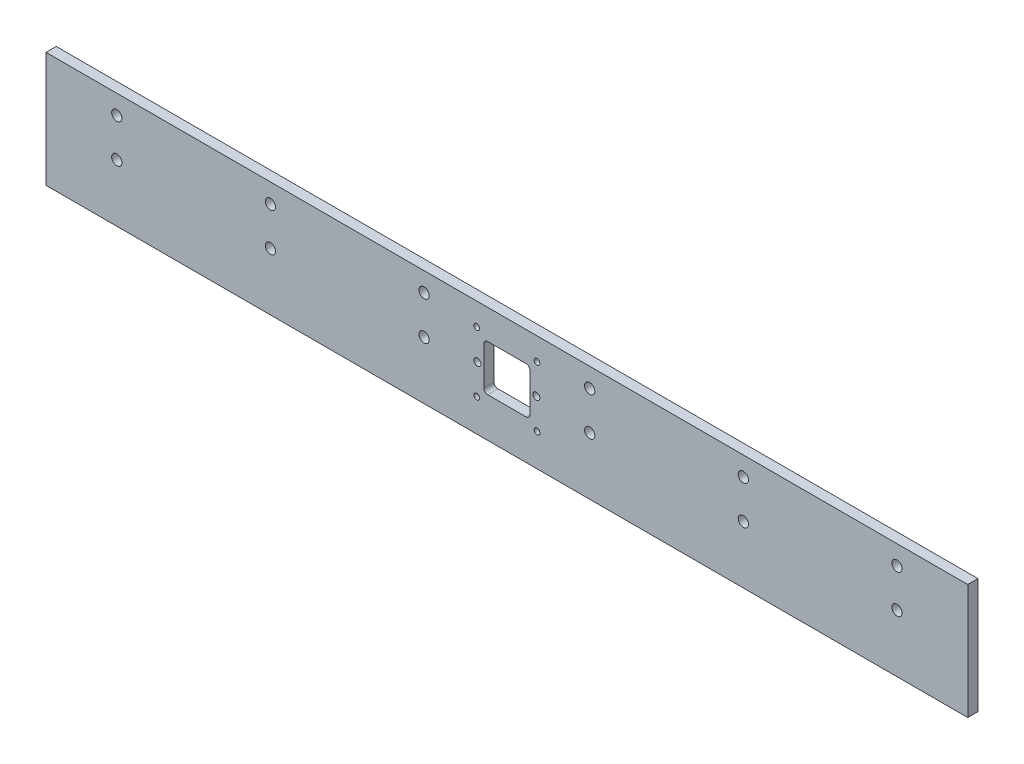
ISO-10303-21;
HEADER;
FILE_DESCRIPTION(('STEP AP214'),'2;1');
FILE_NAME('part.step','',(''),(''),'','','');
FILE_SCHEMA(('AUTOMOTIVE_DESIGN { 1 0 10303 214 1 1 1 1 }'));
ENDSEC;
DATA;
#1=APPLICATION_CONTEXT('core data for automotive mechanical design processes');
#2=APPLICATION_PROTOCOL_DEFINITION('international standard','automotive_design',2000,#1);
#3=PRODUCT_CONTEXT('',#1,'mechanical');
#4=PRODUCT('Part','Part','',(#3));
#5=PRODUCT_RELATED_PRODUCT_CATEGORY('part','',(#4));
#6=PRODUCT_DEFINITION_FORMATION('','',#4);
#7=PRODUCT_DEFINITION_CONTEXT('part definition',#1,'design');
#8=PRODUCT_DEFINITION('design','',#6,#7);
#9=PRODUCT_DEFINITION_SHAPE('','',#8);
#10=(LENGTH_UNIT() NAMED_UNIT(*) SI_UNIT(.MILLI.,.METRE.));
#11=(NAMED_UNIT(*) PLANE_ANGLE_UNIT() SI_UNIT($,.RADIAN.));
#12=(NAMED_UNIT(*) SI_UNIT($,.STERADIAN.) SOLID_ANGLE_UNIT());
#13=UNCERTAINTY_MEASURE_WITH_UNIT(LENGTH_MEASURE(1.E-05),#10,'distance_accuracy_value','');
#14=(GEOMETRIC_REPRESENTATION_CONTEXT(3) GLOBAL_UNCERTAINTY_ASSIGNED_CONTEXT((#13)) GLOBAL_UNIT_ASSIGNED_CONTEXT((#10,
#11,#12)) REPRESENTATION_CONTEXT('',''));
#15=CARTESIAN_POINT('',(0.,0.,0.));
#16=DIRECTION('',(0.,0.,1.));
#17=DIRECTION('',(1.,0.,0.));
#18=AXIS2_PLACEMENT_3D('',#15,#16,#17);
#19=CARTESIAN_POINT('',(0.,0.,8.));
#20=DIRECTION('',(0.,0.,-1.));
#21=DIRECTION('',(-1.,0.,0.));
#22=AXIS2_PLACEMENT_3D('',#19,#20,#21);
#23=PLANE('',#22);
#24=CARTESIAN_POINT('',(524.7,75.0000000000017,8.));
#25=DIRECTION('',(0.,0.,1.));
#26=DIRECTION('',(-1.,0.,0.));
#27=AXIS2_PLACEMENT_3D('',#24,#25,#26);
#28=CIRCLE('',#27,3.99999999999999);
#29=CARTESIAN_POINT('',(520.7,75.0000000000017,8.));
#30=VERTEX_POINT('',#29);
#31=EDGE_CURVE('E164',#30,#30,#28,.T.);
#32=ORIENTED_EDGE('',*,*,#31,.F.);
#33=EDGE_LOOP('',(#32));
#34=FACE_BOUND('',#33,.T.);
#35=CARTESIAN_POINT('',(275.3,45.0000000000033,8.));
#36=DIRECTION('',(0.,0.,1.));
#37=DIRECTION('',(1.,0.,0.));
#38=AXIS2_PLACEMENT_3D('',#35,#36,#37);
#39=CIRCLE('',#38,3.99999999999999);
#40=CARTESIAN_POINT('',(279.3,45.0000000000033,8.));
#41=VERTEX_POINT('',#40);
#42=EDGE_CURVE('E176',#41,#41,#39,.T.);
#43=ORIENTED_EDGE('',*,*,#42,.F.);
#44=EDGE_LOOP('',(#43));
#45=FACE_BOUND('',#44,.T.);
#46=CARTESIAN_POINT('',(155.3,45.0000000000017,8.));
#47=DIRECTION('',(0.,0.,1.));
#48=DIRECTION('',(1.,0.,0.));
#49=AXIS2_PLACEMENT_3D('',#46,#47,#48);
#50=CIRCLE('',#49,3.99999999999999);
#51=CARTESIAN_POINT('',(159.3,45.0000000000017,8.));
#52=VERTEX_POINT('',#51);
#53=EDGE_CURVE('E188',#52,#52,#50,.T.);
#54=ORIENTED_EDGE('',*,*,#53,.F.);
#55=EDGE_LOOP('',(#54));
#56=FACE_BOUND('',#55,.T.);
#57=CARTESIAN_POINT('',(404.7,45.0000000000033,8.));
#58=DIRECTION('',(0.,0.,1.));
#59=DIRECTION('',(-1.,0.,0.));
#60=AXIS2_PLACEMENT_3D('',#57,#58,#59);
#61=CIRCLE('',#60,3.99999999999999);
#62=CARTESIAN_POINT('',(400.7,45.0000000000033,8.));
#63=VERTEX_POINT('',#62);
#64=EDGE_CURVE('E200',#63,#63,#61,.T.);
#65=ORIENTED_EDGE('',*,*,#64,.F.);
#66=EDGE_LOOP('',(#65));
#67=FACE_BOUND('',#66,.T.);
#68=CARTESIAN_POINT('',(644.7,45.,8.));
#69=DIRECTION('',(0.,0.,1.));
#70=DIRECTION('',(-1.,0.,0.));
#71=AXIS2_PLACEMENT_3D('',#68,#69,#70);
#72=CIRCLE('',#71,3.99999999999999);
#73=CARTESIAN_POINT('',(640.7,45.,8.));
#74=VERTEX_POINT('',#73);
#75=EDGE_CURVE('E212',#74,#74,#72,.T.);
#76=ORIENTED_EDGE('',*,*,#75,.F.);
#77=EDGE_LOOP('',(#76));
#78=FACE_BOUND('',#77,.T.);
#79=CARTESIAN_POINT('',(35.3,75.,8.));
#80=DIRECTION('',(0.,0.,1.));
#81=DIRECTION('',(1.,0.,0.));
#82=AXIS2_PLACEMENT_3D('',#79,#80,#81);
#83=CIRCLE('',#82,4.00000000000001);
#84=CARTESIAN_POINT('',(39.3,75.,8.));
#85=VERTEX_POINT('',#84);
#86=EDGE_CURVE('E224',#85,#85,#83,.T.);
#87=ORIENTED_EDGE('',*,*,#86,.F.);
#88=EDGE_LOOP('',(#87));
#89=FACE_BOUND('',#88,.T.);
#90=CARTESIAN_POINT('',(363.55,25.37,8.));
#91=DIRECTION('',(0.,0.,1.));
#92=DIRECTION('',(-1.,0.,0.));
#93=AXIS2_PLACEMENT_3D('',#90,#91,#92);
#94=CIRCLE('',#93,2.24999999999995);
#95=CARTESIAN_POINT('',(361.3,25.37,8.));
#96=VERTEX_POINT('',#95);
#97=EDGE_CURVE('E236',#96,#96,#94,.T.);
#98=ORIENTED_EDGE('',*,*,#97,.F.);
#99=EDGE_LOOP('',(#98));
#100=FACE_BOUND('',#99,.T.);
#101=CARTESIAN_POINT('',(316.45,72.47,8.));
#102=DIRECTION('',(0.,0.,1.));
#103=DIRECTION('',(1.,0.,0.));
#104=AXIS2_PLACEMENT_3D('',#101,#102,#103);
#105=CIRCLE('',#104,2.24999999999995);
#106=CARTESIAN_POINT('',(318.7,72.47,8.));
#107=VERTEX_POINT('',#106);
#108=EDGE_CURVE('E248',#107,#107,#105,.T.);
#109=ORIENTED_EDGE('',*,*,#108,.F.);
#110=EDGE_LOOP('',(#109));
#111=FACE_BOUND('',#110,.T.);
#112=DIRECTION('',(1.,0.,0.));
#113=VECTOR('',#112,1.);
#114=CARTESIAN_POINT('',(325.,30.92,8.));
#115=LINE('',#114,#113);
#116=CARTESIAN_POINT('',(325.,30.92,8.));
#117=VERTEX_POINT('',#116);
#118=CARTESIAN_POINT('',(355.,30.92,8.));
#119=VERTEX_POINT('',#118);
#120=EDGE_CURVE('E260',#117,#119,#115,.T.);
#121=ORIENTED_EDGE('',*,*,#120,.F.);
#122=CARTESIAN_POINT('',(325.,33.92,8.));
#123=DIRECTION('',(0.,0.,1.));
#124=DIRECTION('',(-1.,0.,0.));
#125=AXIS2_PLACEMENT_3D('',#122,#123,#124);
#126=CIRCLE('',#125,3.);
#127=CARTESIAN_POINT('',(322.,33.92,8.));
#128=VERTEX_POINT('',#127);
#129=EDGE_CURVE('E275',#128,#117,#126,.T.);
#130=ORIENTED_EDGE('',*,*,#129,.F.);
#131=DIRECTION('',(0.,-1.,0.));
#132=VECTOR('',#131,1.);
#133=CARTESIAN_POINT('',(322.,63.92,8.));
#134=LINE('',#133,#132);
#135=CARTESIAN_POINT('',(322.,63.92,8.));
#136=VERTEX_POINT('',#135);
#137=EDGE_CURVE('E273',#136,#128,#134,.T.);
#138=ORIENTED_EDGE('',*,*,#137,.F.);
#139=CARTESIAN_POINT('',(325.,63.92,8.));
#140=DIRECTION('',(0.,0.,1.));
#141=DIRECTION('',(-1.,0.,0.));
#142=AXIS2_PLACEMENT_3D('',#139,#140,#141);
#143=CIRCLE('',#142,3.00000000000001);
#144=CARTESIAN_POINT('',(325.,66.92,8.));
#145=VERTEX_POINT('',#144);
#146=EDGE_CURVE('E271',#145,#136,#143,.T.);
#147=ORIENTED_EDGE('',*,*,#146,.F.);
#148=DIRECTION('',(-1.,0.,0.));
#149=VECTOR('',#148,1.);
#150=CARTESIAN_POINT('',(355.,66.92,8.));
#151=LINE('',#150,#149);
#152=CARTESIAN_POINT('',(355.,66.92,8.));
#153=VERTEX_POINT('',#152);
#154=EDGE_CURVE('E269',#153,#145,#151,.T.);
#155=ORIENTED_EDGE('',*,*,#154,.F.);
#156=CARTESIAN_POINT('',(355.,63.92,8.));
#157=DIRECTION('',(0.,0.,1.));
#158=DIRECTION('',(-1.,0.,0.));
#159=AXIS2_PLACEMENT_3D('',#156,#157,#158);
#160=CIRCLE('',#159,3.00000000000001);
#161=CARTESIAN_POINT('',(358.,63.92,8.));
#162=VERTEX_POINT('',#161);
#163=EDGE_CURVE('E267',#162,#153,#160,.T.);
#164=ORIENTED_EDGE('',*,*,#163,.F.);
#165=DIRECTION('',(0.,1.,0.));
#166=VECTOR('',#165,1.);
#167=CARTESIAN_POINT('',(358.,33.92,8.));
#168=LINE('',#167,#166);
#169=CARTESIAN_POINT('',(358.,33.92,8.));
#170=VERTEX_POINT('',#169);
#171=EDGE_CURVE('E265',#170,#162,#168,.T.);
#172=ORIENTED_EDGE('',*,*,#171,.F.);
#173=CARTESIAN_POINT('',(355.,33.92,8.));
#174=DIRECTION('',(0.,0.,1.));
#175=DIRECTION('',(-1.,0.,0.));
#176=AXIS2_PLACEMENT_3D('',#173,#174,#175);
#177=CIRCLE('',#176,3.);
#178=EDGE_CURVE('E262',#119,#170,#177,.T.);
#179=ORIENTED_EDGE('',*,*,#178,.F.);
#180=EDGE_LOOP('',(#121,#130,#138,#147,#155,#164,#172,#179));
#181=FACE_BOUND('',#180,.T.);
#182=DIRECTION('',(-1.,0.,0.));
#183=VECTOR('',#182,1.);
#184=CARTESIAN_POINT('',(0.,90.,8.));
#185=LINE('',#184,#183);
#186=CARTESIAN_POINT('',(700.,90.,8.));
#187=VERTEX_POINT('',#186);
#188=CARTESIAN_POINT('',(-20.,90.,8.));
#189=VERTEX_POINT('',#188);
#190=EDGE_CURVE('E11',#187,#189,#185,.T.);
#191=ORIENTED_EDGE('',*,*,#190,.T.);
#192=DIRECTION('',(0.,1.,0.));
#193=VECTOR('',#192,1.);
#194=CARTESIAN_POINT('',(-20.,90.,8.));
#195=LINE('',#194,#193);
#196=CARTESIAN_POINT('',(-20.,0.,8.));
#197=VERTEX_POINT('',#196);
#198=EDGE_CURVE('E138',#197,#189,#195,.T.);
#199=ORIENTED_EDGE('',*,*,#198,.F.);
#200=DIRECTION('',(1.,0.,0.));
#201=VECTOR('',#200,1.);
#202=CARTESIAN_POINT('',(0.,0.,8.));
#203=LINE('',#202,#201);
#204=CARTESIAN_POINT('',(700.,0.,8.));
#205=VERTEX_POINT('',#204);
#206=EDGE_CURVE('E41',#197,#205,#203,.T.);
#207=ORIENTED_EDGE('',*,*,#206,.T.);
#208=DIRECTION('',(0.,-1.,0.));
#209=VECTOR('',#208,1.);
#210=CARTESIAN_POINT('',(700.,90.,8.));
#211=LINE('',#210,#209);
#212=EDGE_CURVE('E148',#187,#205,#211,.T.);
#213=ORIENTED_EDGE('',*,*,#212,.F.);
#214=EDGE_LOOP('',(#191,#199,#207,#213));
#215=FACE_BOUND('',#214,.T.);
#216=CARTESIAN_POINT('',(317.,48.92,8.));
#217=DIRECTION('',(0.,0.,1.));
#218=DIRECTION('',(1.,0.,0.));
#219=AXIS2_PLACEMENT_3D('',#216,#217,#218);
#220=CIRCLE('',#219,2.74999999999998);
#221=CARTESIAN_POINT('',(319.75,48.92,8.));
#222=VERTEX_POINT('',#221);
#223=EDGE_CURVE('E132',#222,#222,#220,.T.);
#224=ORIENTED_EDGE('',*,*,#223,.F.);
#225=EDGE_LOOP('',(#224));
#226=FACE_BOUND('',#225,.T.);
#227=CARTESIAN_POINT('',(363.,48.92,8.));
#228=DIRECTION('',(0.,0.,1.));
#229=DIRECTION('',(1.,0.,0.));
#230=AXIS2_PLACEMENT_3D('',#227,#228,#229);
#231=CIRCLE('',#230,2.74999999999998);
#232=CARTESIAN_POINT('',(365.75,48.92,8.));
#233=VERTEX_POINT('',#232);
#234=EDGE_CURVE('E254',#233,#233,#231,.T.);
#235=ORIENTED_EDGE('',*,*,#234,.F.);
#236=EDGE_LOOP('',(#235));
#237=FACE_BOUND('',#236,.T.);
#238=CARTESIAN_POINT('',(363.55,72.47,8.));
#239=DIRECTION('',(0.,0.,1.));
#240=DIRECTION('',(1.,0.,0.));
#241=AXIS2_PLACEMENT_3D('',#238,#239,#240);
#242=CIRCLE('',#241,2.24999999999995);
#243=CARTESIAN_POINT('',(365.8,72.47,8.));
#244=VERTEX_POINT('',#243);
#245=EDGE_CURVE('E242',#244,#244,#242,.T.);
#246=ORIENTED_EDGE('',*,*,#245,.F.);
#247=EDGE_LOOP('',(#246));
#248=FACE_BOUND('',#247,.T.);
#249=CARTESIAN_POINT('',(316.45,25.37,8.));
#250=DIRECTION('',(0.,0.,1.));
#251=DIRECTION('',(-1.,0.,0.));
#252=AXIS2_PLACEMENT_3D('',#249,#250,#251);
#253=CIRCLE('',#252,2.24999999999995);
#254=CARTESIAN_POINT('',(314.2,25.37,8.));
#255=VERTEX_POINT('',#254);
#256=EDGE_CURVE('E230',#255,#255,#253,.T.);
#257=ORIENTED_EDGE('',*,*,#256,.F.);
#258=EDGE_LOOP('',(#257));
#259=FACE_BOUND('',#258,.T.);
#260=CARTESIAN_POINT('',(35.3,45.,8.));
#261=DIRECTION('',(0.,0.,1.));
#262=DIRECTION('',(1.,0.,0.));
#263=AXIS2_PLACEMENT_3D('',#260,#261,#262);
#264=CIRCLE('',#263,4.00000000000001);
#265=CARTESIAN_POINT('',(39.3,45.,8.));
#266=VERTEX_POINT('',#265);
#267=EDGE_CURVE('E218',#266,#266,#264,.T.);
#268=ORIENTED_EDGE('',*,*,#267,.F.);
#269=EDGE_LOOP('',(#268));
#270=FACE_BOUND('',#269,.T.);
#271=CARTESIAN_POINT('',(644.7,75.,8.));
#272=DIRECTION('',(0.,0.,1.));
#273=DIRECTION('',(-1.,0.,0.));
#274=AXIS2_PLACEMENT_3D('',#271,#272,#273);
#275=CIRCLE('',#274,3.99999999999999);
#276=CARTESIAN_POINT('',(640.7,75.,8.));
#277=VERTEX_POINT('',#276);
#278=EDGE_CURVE('E206',#277,#277,#275,.T.);
#279=ORIENTED_EDGE('',*,*,#278,.F.);
#280=EDGE_LOOP('',(#279));
#281=FACE_BOUND('',#280,.T.);
#282=CARTESIAN_POINT('',(155.3,75.0000000000017,8.));
#283=DIRECTION('',(0.,0.,1.));
#284=DIRECTION('',(1.,0.,0.));
#285=AXIS2_PLACEMENT_3D('',#282,#283,#284);
#286=CIRCLE('',#285,3.99999999999999);
#287=CARTESIAN_POINT('',(159.3,75.0000000000017,8.));
#288=VERTEX_POINT('',#287);
#289=EDGE_CURVE('E194',#288,#288,#286,.T.);
#290=ORIENTED_EDGE('',*,*,#289,.F.);
#291=EDGE_LOOP('',(#290));
#292=FACE_BOUND('',#291,.T.);
#293=CARTESIAN_POINT('',(275.3,75.0000000000034,8.));
#294=DIRECTION('',(0.,0.,1.));
#295=DIRECTION('',(1.,0.,0.));
#296=AXIS2_PLACEMENT_3D('',#293,#294,#295);
#297=CIRCLE('',#296,3.99999999999999);
#298=CARTESIAN_POINT('',(279.3,75.0000000000034,8.));
#299=VERTEX_POINT('',#298);
#300=EDGE_CURVE('E182',#299,#299,#297,.T.);
#301=ORIENTED_EDGE('',*,*,#300,.F.);
#302=EDGE_LOOP('',(#301));
#303=FACE_BOUND('',#302,.T.);
#304=CARTESIAN_POINT('',(404.7,75.0000000000034,8.));
#305=DIRECTION('',(0.,0.,1.));
#306=DIRECTION('',(-1.,0.,0.));
#307=AXIS2_PLACEMENT_3D('',#304,#305,#306);
#308=CIRCLE('',#307,3.99999999999999);
#309=CARTESIAN_POINT('',(400.7,75.0000000000034,8.));
#310=VERTEX_POINT('',#309);
#311=EDGE_CURVE('E170',#310,#310,#308,.T.);
#312=ORIENTED_EDGE('',*,*,#311,.F.);
#313=EDGE_LOOP('',(#312));
#314=FACE_BOUND('',#313,.T.);
#315=CARTESIAN_POINT('',(524.7,45.0000000000017,8.));
#316=DIRECTION('',(0.,0.,1.));
#317=DIRECTION('',(-1.,0.,0.));
#318=AXIS2_PLACEMENT_3D('',#315,#316,#317);
#319=CIRCLE('',#318,3.99999999999999);
#320=CARTESIAN_POINT('',(520.7,45.0000000000017,8.));
#321=VERTEX_POINT('',#320);
#322=EDGE_CURVE('E158',#321,#321,#319,.T.);
#323=ORIENTED_EDGE('',*,*,#322,.F.);
#324=EDGE_LOOP('',(#323));
#325=FACE_BOUND('',#324,.T.);
#326=ADVANCED_FACE('F32',(#34,#45,#56,#67,#78,#89,#100,#111,#181,#215,#226,#237,#248,#259,#270,
#281,#292,#303,#314,#325),#23,.F.);
#327=CARTESIAN_POINT('',(0.,0.,0.));
#328=DIRECTION('',(0.,0.,-1.));
#329=DIRECTION('',(-1.,0.,0.));
#330=AXIS2_PLACEMENT_3D('',#327,#328,#329);
#331=PLANE('',#330);
#332=CARTESIAN_POINT('',(524.7,75.0000000000017,0.));
#333=DIRECTION('',(0.,0.,1.));
#334=DIRECTION('',(-1.,0.,0.));
#335=AXIS2_PLACEMENT_3D('',#332,#333,#334);
#336=CIRCLE('',#335,3.99999999999999);
#337=CARTESIAN_POINT('',(520.7,75.0000000000017,0.));
#338=VERTEX_POINT('',#337);
#339=EDGE_CURVE('E161',#338,#338,#336,.T.);
#340=ORIENTED_EDGE('',*,*,#339,.T.);
#341=EDGE_LOOP('',(#340));
#342=FACE_BOUND('',#341,.T.);
#343=CARTESIAN_POINT('',(275.3,45.0000000000033,0.));
#344=DIRECTION('',(0.,0.,1.));
#345=DIRECTION('',(1.,0.,0.));
#346=AXIS2_PLACEMENT_3D('',#343,#344,#345);
#347=CIRCLE('',#346,3.99999999999999);
#348=CARTESIAN_POINT('',(279.3,45.0000000000033,0.));
#349=VERTEX_POINT('',#348);
#350=EDGE_CURVE('E173',#349,#349,#347,.T.);
#351=ORIENTED_EDGE('',*,*,#350,.T.);
#352=EDGE_LOOP('',(#351));
#353=FACE_BOUND('',#352,.T.);
#354=CARTESIAN_POINT('',(155.3,45.0000000000017,0.));
#355=DIRECTION('',(0.,0.,1.));
#356=DIRECTION('',(1.,0.,0.));
#357=AXIS2_PLACEMENT_3D('',#354,#355,#356);
#358=CIRCLE('',#357,3.99999999999999);
#359=CARTESIAN_POINT('',(159.3,45.0000000000017,0.));
#360=VERTEX_POINT('',#359);
#361=EDGE_CURVE('E185',#360,#360,#358,.T.);
#362=ORIENTED_EDGE('',*,*,#361,.T.);
#363=EDGE_LOOP('',(#362));
#364=FACE_BOUND('',#363,.T.);
#365=CARTESIAN_POINT('',(404.7,45.0000000000033,0.));
#366=DIRECTION('',(0.,0.,1.));
#367=DIRECTION('',(-1.,0.,0.));
#368=AXIS2_PLACEMENT_3D('',#365,#366,#367);
#369=CIRCLE('',#368,3.99999999999999);
#370=CARTESIAN_POINT('',(400.7,45.0000000000033,0.));
#371=VERTEX_POINT('',#370);
#372=EDGE_CURVE('E197',#371,#371,#369,.T.);
#373=ORIENTED_EDGE('',*,*,#372,.T.);
#374=EDGE_LOOP('',(#373));
#375=FACE_BOUND('',#374,.T.);
#376=CARTESIAN_POINT('',(644.7,45.,0.));
#377=DIRECTION('',(0.,0.,1.));
#378=DIRECTION('',(-1.,0.,0.));
#379=AXIS2_PLACEMENT_3D('',#376,#377,#378);
#380=CIRCLE('',#379,3.99999999999999);
#381=CARTESIAN_POINT('',(640.7,45.,0.));
#382=VERTEX_POINT('',#381);
#383=EDGE_CURVE('E209',#382,#382,#380,.T.);
#384=ORIENTED_EDGE('',*,*,#383,.T.);
#385=EDGE_LOOP('',(#384));
#386=FACE_BOUND('',#385,.T.);
#387=CARTESIAN_POINT('',(35.3,75.,0.));
#388=DIRECTION('',(0.,0.,1.));
#389=DIRECTION('',(1.,0.,0.));
#390=AXIS2_PLACEMENT_3D('',#387,#388,#389);
#391=CIRCLE('',#390,4.00000000000001);
#392=CARTESIAN_POINT('',(39.3,75.,0.));
#393=VERTEX_POINT('',#392);
#394=EDGE_CURVE('E221',#393,#393,#391,.T.);
#395=ORIENTED_EDGE('',*,*,#394,.T.);
#396=EDGE_LOOP('',(#395));
#397=FACE_BOUND('',#396,.T.);
#398=CARTESIAN_POINT('',(363.55,25.37,0.));
#399=DIRECTION('',(0.,0.,1.));
#400=DIRECTION('',(-1.,0.,0.));
#401=AXIS2_PLACEMENT_3D('',#398,#399,#400);
#402=CIRCLE('',#401,2.24999999999995);
#403=CARTESIAN_POINT('',(361.3,25.37,0.));
#404=VERTEX_POINT('',#403);
#405=EDGE_CURVE('E233',#404,#404,#402,.T.);
#406=ORIENTED_EDGE('',*,*,#405,.T.);
#407=EDGE_LOOP('',(#406));
#408=FACE_BOUND('',#407,.T.);
#409=CARTESIAN_POINT('',(316.45,72.47,0.));
#410=DIRECTION('',(0.,0.,1.));
#411=DIRECTION('',(1.,0.,0.));
#412=AXIS2_PLACEMENT_3D('',#409,#410,#411);
#413=CIRCLE('',#412,2.24999999999995);
#414=CARTESIAN_POINT('',(318.7,72.47,0.));
#415=VERTEX_POINT('',#414);
#416=EDGE_CURVE('E245',#415,#415,#413,.T.);
#417=ORIENTED_EDGE('',*,*,#416,.T.);
#418=EDGE_LOOP('',(#417));
#419=FACE_BOUND('',#418,.T.);
#420=CARTESIAN_POINT('',(325.,33.92,0.));
#421=DIRECTION('',(0.,0.,1.));
#422=DIRECTION('',(-1.,0.,0.));
#423=AXIS2_PLACEMENT_3D('',#420,#421,#422);
#424=CIRCLE('',#423,3.);
#425=CARTESIAN_POINT('',(322.,33.92,0.));
#426=VERTEX_POINT('',#425);
#427=CARTESIAN_POINT('',(325.,30.92,0.));
#428=VERTEX_POINT('',#427);
#429=EDGE_CURVE('E263',#426,#428,#424,.T.);
#430=ORIENTED_EDGE('',*,*,#429,.T.);
#431=DIRECTION('',(1.,0.,0.));
#432=VECTOR('',#431,1.);
#433=CARTESIAN_POINT('',(340.,30.92,0.));
#434=LINE('',#433,#432);
#435=CARTESIAN_POINT('',(355.,30.92,0.));
#436=VERTEX_POINT('',#435);
#437=EDGE_CURVE('E257',#428,#436,#434,.T.);
#438=ORIENTED_EDGE('',*,*,#437,.T.);
#439=CARTESIAN_POINT('',(355.,33.92,0.));
#440=DIRECTION('',(0.,0.,1.));
#441=DIRECTION('',(-1.,0.,0.));
#442=AXIS2_PLACEMENT_3D('',#439,#440,#441);
#443=CIRCLE('',#442,3.);
#444=CARTESIAN_POINT('',(358.,33.92,0.));
#445=VERTEX_POINT('',#444);
#446=EDGE_CURVE('E279',#436,#445,#443,.T.);
#447=ORIENTED_EDGE('',*,*,#446,.T.);
#448=DIRECTION('',(0.,1.,0.));
#449=VECTOR('',#448,1.);
#450=CARTESIAN_POINT('',(358.,33.92,0.));
#451=LINE('',#450,#449);
#452=CARTESIAN_POINT('',(358.,63.92,0.));
#453=VERTEX_POINT('',#452);
#454=EDGE_CURVE('E282',#445,#453,#451,.T.);
#455=ORIENTED_EDGE('',*,*,#454,.T.);
#456=CARTESIAN_POINT('',(355.,63.92,0.));
#457=DIRECTION('',(0.,0.,1.));
#458=DIRECTION('',(-1.,0.,0.));
#459=AXIS2_PLACEMENT_3D('',#456,#457,#458);
#460=CIRCLE('',#459,3.00000000000001);
#461=CARTESIAN_POINT('',(355.,66.92,0.));
#462=VERTEX_POINT('',#461);
#463=EDGE_CURVE('E285',#453,#462,#460,.T.);
#464=ORIENTED_EDGE('',*,*,#463,.T.);
#465=DIRECTION('',(-1.,0.,0.));
#466=VECTOR('',#465,1.);
#467=CARTESIAN_POINT('',(355.,66.92,0.));
#468=LINE('',#467,#466);
#469=CARTESIAN_POINT('',(325.,66.92,0.));
#470=VERTEX_POINT('',#469);
#471=EDGE_CURVE('E288',#462,#470,#468,.T.);
#472=ORIENTED_EDGE('',*,*,#471,.T.);
#473=CARTESIAN_POINT('',(325.,63.92,0.));
#474=DIRECTION('',(0.,0.,1.));
#475=DIRECTION('',(-1.,0.,0.));
#476=AXIS2_PLACEMENT_3D('',#473,#474,#475);
#477=CIRCLE('',#476,3.00000000000001);
#478=CARTESIAN_POINT('',(322.,63.92,0.));
#479=VERTEX_POINT('',#478);
#480=EDGE_CURVE('E291',#470,#479,#477,.T.);
#481=ORIENTED_EDGE('',*,*,#480,.T.);
#482=DIRECTION('',(0.,-1.,0.));
#483=VECTOR('',#482,1.);
#484=CARTESIAN_POINT('',(322.,63.92,0.));
#485=LINE('',#484,#483);
#486=EDGE_CURVE('E294',#479,#426,#485,.T.);
#487=ORIENTED_EDGE('',*,*,#486,.T.);
#488=EDGE_LOOP('',(#430,#438,#447,#455,#464,#472,#481,#487));
#489=FACE_BOUND('',#488,.T.);
#490=DIRECTION('',(1.,0.,0.));
#491=VECTOR('',#490,1.);
#492=CARTESIAN_POINT('',(0.,0.,0.));
#493=LINE('',#492,#491);
#494=CARTESIAN_POINT('',(-20.,0.,0.));
#495=VERTEX_POINT('',#494);
#496=CARTESIAN_POINT('',(700.,0.,0.));
#497=VERTEX_POINT('',#496);
#498=EDGE_CURVE('E121',#495,#497,#493,.T.);
#499=ORIENTED_EDGE('',*,*,#498,.F.);
#500=DIRECTION('',(0.,-1.,0.));
#501=VECTOR('',#500,1.);
#502=CARTESIAN_POINT('',(-20.,90.,0.));
#503=LINE('',#502,#501);
#504=CARTESIAN_POINT('',(-20.,90.,0.));
#505=VERTEX_POINT('',#504);
#506=EDGE_CURVE('E126',#505,#495,#503,.T.);
#507=ORIENTED_EDGE('',*,*,#506,.F.);
#508=DIRECTION('',(-1.,0.,0.));
#509=VECTOR('',#508,1.);
#510=CARTESIAN_POINT('',(0.,90.,0.));
#511=LINE('',#510,#509);
#512=CARTESIAN_POINT('',(700.,90.,0.));
#513=VERTEX_POINT('',#512);
#514=EDGE_CURVE('E36',#513,#505,#511,.T.);
#515=ORIENTED_EDGE('',*,*,#514,.F.);
#516=DIRECTION('',(0.,1.,0.));
#517=VECTOR('',#516,1.);
#518=CARTESIAN_POINT('',(700.,90.,0.));
#519=LINE('',#518,#517);
#520=EDGE_CURVE('E128',#497,#513,#519,.T.);
#521=ORIENTED_EDGE('',*,*,#520,.F.);
#522=EDGE_LOOP('',(#499,#507,#515,#521));
#523=FACE_BOUND('',#522,.T.);
#524=CARTESIAN_POINT('',(317.,48.92,0.));
#525=DIRECTION('',(0.,0.,1.));
#526=DIRECTION('',(1.,0.,0.));
#527=AXIS2_PLACEMENT_3D('',#524,#525,#526);
#528=CIRCLE('',#527,2.74999999999998);
#529=CARTESIAN_POINT('',(319.75,48.92,0.));
#530=VERTEX_POINT('',#529);
#531=EDGE_CURVE('E313',#530,#530,#528,.T.);
#532=ORIENTED_EDGE('',*,*,#531,.T.);
#533=EDGE_LOOP('',(#532));
#534=FACE_BOUND('',#533,.T.);
#535=CARTESIAN_POINT('',(363.,48.92,0.));
#536=DIRECTION('',(0.,0.,1.));
#537=DIRECTION('',(1.,0.,0.));
#538=AXIS2_PLACEMENT_3D('',#535,#536,#537);
#539=CIRCLE('',#538,2.74999999999998);
#540=CARTESIAN_POINT('',(365.75,48.92,0.));
#541=VERTEX_POINT('',#540);
#542=EDGE_CURVE('E251',#541,#541,#539,.T.);
#543=ORIENTED_EDGE('',*,*,#542,.T.);
#544=EDGE_LOOP('',(#543));
#545=FACE_BOUND('',#544,.T.);
#546=CARTESIAN_POINT('',(363.55,72.47,0.));
#547=DIRECTION('',(0.,0.,1.));
#548=DIRECTION('',(1.,0.,0.));
#549=AXIS2_PLACEMENT_3D('',#546,#547,#548);
#550=CIRCLE('',#549,2.24999999999995);
#551=CARTESIAN_POINT('',(365.8,72.47,0.));
#552=VERTEX_POINT('',#551);
#553=EDGE_CURVE('E239',#552,#552,#550,.T.);
#554=ORIENTED_EDGE('',*,*,#553,.T.);
#555=EDGE_LOOP('',(#554));
#556=FACE_BOUND('',#555,.T.);
#557=CARTESIAN_POINT('',(316.45,25.37,0.));
#558=DIRECTION('',(0.,0.,1.));
#559=DIRECTION('',(-1.,0.,0.));
#560=AXIS2_PLACEMENT_3D('',#557,#558,#559);
#561=CIRCLE('',#560,2.24999999999995);
#562=CARTESIAN_POINT('',(314.2,25.37,0.));
#563=VERTEX_POINT('',#562);
#564=EDGE_CURVE('E227',#563,#563,#561,.T.);
#565=ORIENTED_EDGE('',*,*,#564,.T.);
#566=EDGE_LOOP('',(#565));
#567=FACE_BOUND('',#566,.T.);
#568=CARTESIAN_POINT('',(35.3,45.,0.));
#569=DIRECTION('',(0.,0.,1.));
#570=DIRECTION('',(1.,0.,0.));
#571=AXIS2_PLACEMENT_3D('',#568,#569,#570);
#572=CIRCLE('',#571,4.00000000000001);
#573=CARTESIAN_POINT('',(39.3,45.,0.));
#574=VERTEX_POINT('',#573);
#575=EDGE_CURVE('E215',#574,#574,#572,.T.);
#576=ORIENTED_EDGE('',*,*,#575,.T.);
#577=EDGE_LOOP('',(#576));
#578=FACE_BOUND('',#577,.T.);
#579=CARTESIAN_POINT('',(644.7,75.,0.));
#580=DIRECTION('',(0.,0.,1.));
#581=DIRECTION('',(-1.,0.,0.));
#582=AXIS2_PLACEMENT_3D('',#579,#580,#581);
#583=CIRCLE('',#582,3.99999999999999);
#584=CARTESIAN_POINT('',(640.7,75.,0.));
#585=VERTEX_POINT('',#584);
#586=EDGE_CURVE('E203',#585,#585,#583,.T.);
#587=ORIENTED_EDGE('',*,*,#586,.T.);
#588=EDGE_LOOP('',(#587));
#589=FACE_BOUND('',#588,.T.);
#590=CARTESIAN_POINT('',(155.3,75.0000000000017,0.));
#591=DIRECTION('',(0.,0.,1.));
#592=DIRECTION('',(1.,0.,0.));
#593=AXIS2_PLACEMENT_3D('',#590,#591,#592);
#594=CIRCLE('',#593,3.99999999999999);
#595=CARTESIAN_POINT('',(159.3,75.0000000000017,0.));
#596=VERTEX_POINT('',#595);
#597=EDGE_CURVE('E191',#596,#596,#594,.T.);
#598=ORIENTED_EDGE('',*,*,#597,.T.);
#599=EDGE_LOOP('',(#598));
#600=FACE_BOUND('',#599,.T.);
#601=CARTESIAN_POINT('',(275.3,75.0000000000034,0.));
#602=DIRECTION('',(0.,0.,1.));
#603=DIRECTION('',(1.,0.,0.));
#604=AXIS2_PLACEMENT_3D('',#601,#602,#603);
#605=CIRCLE('',#604,3.99999999999999);
#606=CARTESIAN_POINT('',(279.3,75.0000000000034,0.));
#607=VERTEX_POINT('',#606);
#608=EDGE_CURVE('E179',#607,#607,#605,.T.);
#609=ORIENTED_EDGE('',*,*,#608,.T.);
#610=EDGE_LOOP('',(#609));
#611=FACE_BOUND('',#610,.T.);
#612=CARTESIAN_POINT('',(404.7,75.0000000000034,0.));
#613=DIRECTION('',(0.,0.,1.));
#614=DIRECTION('',(-1.,0.,0.));
#615=AXIS2_PLACEMENT_3D('',#612,#613,#614);
#616=CIRCLE('',#615,3.99999999999999);
#617=CARTESIAN_POINT('',(400.7,75.0000000000034,0.));
#618=VERTEX_POINT('',#617);
#619=EDGE_CURVE('E167',#618,#618,#616,.T.);
#620=ORIENTED_EDGE('',*,*,#619,.T.);
#621=EDGE_LOOP('',(#620));
#622=FACE_BOUND('',#621,.T.);
#623=CARTESIAN_POINT('',(524.7,45.0000000000017,0.));
#624=DIRECTION('',(0.,0.,1.));
#625=DIRECTION('',(-1.,0.,0.));
#626=AXIS2_PLACEMENT_3D('',#623,#624,#625);
#627=CIRCLE('',#626,3.99999999999999);
#628=CARTESIAN_POINT('',(520.7,45.0000000000017,0.));
#629=VERTEX_POINT('',#628);
#630=EDGE_CURVE('E157',#629,#629,#627,.T.);
#631=ORIENTED_EDGE('',*,*,#630,.T.);
#632=EDGE_LOOP('',(#631));
#633=FACE_BOUND('',#632,.T.);
#634=ADVANCED_FACE('F123',(#342,#353,#364,#375,#386,#397,#408,#419,#489,#523,#534,#545,#556,
#567,#578,#589,#600,#611,#622,#633),#331,.T.);
#635=CARTESIAN_POINT('',(0.,0.,8.));
#636=DIRECTION('',(0.,1.,0.));
#637=DIRECTION('',(-1.,0.,0.));
#638=AXIS2_PLACEMENT_3D('',#635,#636,#637);
#639=PLANE('',#638);
#640=ORIENTED_EDGE('',*,*,#498,.T.);
#641=DIRECTION('',(0.,0.,-1.));
#642=VECTOR('',#641,1.);
#643=CARTESIAN_POINT('',(700.,0.,8.));
#644=LINE('',#643,#642);
#645=EDGE_CURVE('E151',#205,#497,#644,.T.);
#646=ORIENTED_EDGE('',*,*,#645,.F.);
#647=ORIENTED_EDGE('',*,*,#206,.F.);
#648=DIRECTION('',(0.,0.,1.));
#649=VECTOR('',#648,1.);
#650=CARTESIAN_POINT('',(-20.,0.,0.));
#651=LINE('',#650,#649);
#652=EDGE_CURVE('E134',#495,#197,#651,.T.);
#653=ORIENTED_EDGE('',*,*,#652,.F.);
#654=EDGE_LOOP('',(#640,#646,#647,#653));
#655=FACE_BOUND('',#654,.T.);
#656=ADVANCED_FACE('F34',(#655),#639,.F.);
#657=CARTESIAN_POINT('',(0.,90.,8.));
#658=DIRECTION('',(0.,-1.,0.));
#659=DIRECTION('',(1.,0.,0.));
#660=AXIS2_PLACEMENT_3D('',#657,#658,#659);
#661=PLANE('',#660);
#662=ORIENTED_EDGE('',*,*,#514,.T.);
#663=DIRECTION('',(0.,0.,-1.));
#664=VECTOR('',#663,1.);
#665=CARTESIAN_POINT('',(-20.,90.,0.));
#666=LINE('',#665,#664);
#667=EDGE_CURVE('E143',#189,#505,#666,.T.);
#668=ORIENTED_EDGE('',*,*,#667,.F.);
#669=ORIENTED_EDGE('',*,*,#190,.F.);
#670=DIRECTION('',(0.,0.,1.));
#671=VECTOR('',#670,1.);
#672=CARTESIAN_POINT('',(700.,90.,8.));
#673=LINE('',#672,#671);
#674=EDGE_CURVE('E154',#513,#187,#673,.T.);
#675=ORIENTED_EDGE('',*,*,#674,.F.);
#676=EDGE_LOOP('',(#662,#668,#669,#675));
#677=FACE_BOUND('',#676,.T.);
#678=ADVANCED_FACE('F322',(#677),#661,.F.);
#679=CARTESIAN_POINT('',(317.,48.92,8.));
#680=DIRECTION('',(0.,0.,-1.));
#681=DIRECTION('',(-1.,0.,0.));
#682=AXIS2_PLACEMENT_3D('',#679,#680,#681);
#683=CYLINDRICAL_SURFACE('',#682,2.74999999999998);
#684=ORIENTED_EDGE('',*,*,#223,.T.);
#685=EDGE_LOOP('',(#684));
#686=FACE_BOUND('',#685,.T.);
#687=ORIENTED_EDGE('',*,*,#531,.F.);
#688=EDGE_LOOP('',(#687));
#689=FACE_BOUND('',#688,.T.);
#690=ADVANCED_FACE('F365',(#686,#689),#683,.F.);
#691=CARTESIAN_POINT('',(340.,30.92,8.));
#692=DIRECTION('',(0.,1.,0.));
#693=DIRECTION('',(0.,0.,1.));
#694=AXIS2_PLACEMENT_3D('',#691,#692,#693);
#695=PLANE('',#694);
#696=ORIENTED_EDGE('',*,*,#437,.F.);
#697=DIRECTION('',(0.,0.,-1.));
#698=VECTOR('',#697,1.);
#699=CARTESIAN_POINT('',(325.,30.92,8.));
#700=LINE('',#699,#698);
#701=EDGE_CURVE('E54',#117,#428,#700,.T.);
#702=ORIENTED_EDGE('',*,*,#701,.F.);
#703=ORIENTED_EDGE('',*,*,#120,.T.);
#704=DIRECTION('',(0.,0.,-1.));
#705=VECTOR('',#704,1.);
#706=CARTESIAN_POINT('',(355.,30.92,8.));
#707=LINE('',#706,#705);
#708=EDGE_CURVE('E311',#119,#436,#707,.T.);
#709=ORIENTED_EDGE('',*,*,#708,.T.);
#710=EDGE_LOOP('',(#696,#702,#703,#709));
#711=FACE_BOUND('',#710,.T.);
#712=ADVANCED_FACE('F369',(#711),#695,.T.);
#713=CARTESIAN_POINT('',(355.,33.92,8.));
#714=DIRECTION('',(0.,0.,-1.));
#715=DIRECTION('',(-1.,0.,0.));
#716=AXIS2_PLACEMENT_3D('',#713,#714,#715);
#717=CYLINDRICAL_SURFACE('',#716,3.);
#718=ORIENTED_EDGE('',*,*,#446,.F.);
#719=ORIENTED_EDGE('',*,*,#708,.F.);
#720=ORIENTED_EDGE('',*,*,#178,.T.);
#721=DIRECTION('',(0.,0.,-1.));
#722=VECTOR('',#721,1.);
#723=CARTESIAN_POINT('',(358.,33.92,8.));
#724=LINE('',#723,#722);
#725=EDGE_CURVE('E309',#170,#445,#724,.T.);
#726=ORIENTED_EDGE('',*,*,#725,.T.);
#727=EDGE_LOOP('',(#718,#719,#720,#726));
#728=FACE_BOUND('',#727,.T.);
#729=ADVANCED_FACE('F374',(#728),#717,.F.);
#730=CARTESIAN_POINT('',(358.,33.92,8.));
#731=DIRECTION('',(-1.,0.,0.));
#732=DIRECTION('',(0.,0.,1.));
#733=AXIS2_PLACEMENT_3D('',#730,#731,#732);
#734=PLANE('',#733);
#735=ORIENTED_EDGE('',*,*,#454,.F.);
#736=ORIENTED_EDGE('',*,*,#725,.F.);
#737=ORIENTED_EDGE('',*,*,#171,.T.);
#738=DIRECTION('',(0.,0.,-1.));
#739=VECTOR('',#738,1.);
#740=CARTESIAN_POINT('',(358.,63.92,8.));
#741=LINE('',#740,#739);
#742=EDGE_CURVE('E307',#162,#453,#741,.T.);
#743=ORIENTED_EDGE('',*,*,#742,.T.);
#744=EDGE_LOOP('',(#735,#736,#737,#743));
#745=FACE_BOUND('',#744,.T.);
#746=ADVANCED_FACE('F381',(#745),#734,.T.);
#747=CARTESIAN_POINT('',(355.,63.92,8.));
#748=DIRECTION('',(0.,0.,-1.));
#749=DIRECTION('',(-1.,0.,0.));
#750=AXIS2_PLACEMENT_3D('',#747,#748,#749);
#751=CYLINDRICAL_SURFACE('',#750,3.00000000000001);
#752=ORIENTED_EDGE('',*,*,#463,.F.);
#753=ORIENTED_EDGE('',*,*,#742,.F.);
#754=ORIENTED_EDGE('',*,*,#163,.T.);
#755=DIRECTION('',(0.,0.,-1.));
#756=VECTOR('',#755,1.);
#757=CARTESIAN_POINT('',(355.,66.92,8.));
#758=LINE('',#757,#756);
#759=EDGE_CURVE('E305',#153,#462,#758,.T.);
#760=ORIENTED_EDGE('',*,*,#759,.T.);
#761=EDGE_LOOP('',(#752,#753,#754,#760));
#762=FACE_BOUND('',#761,.T.);
#763=ADVANCED_FACE('F385',(#762),#751,.F.);
#764=CARTESIAN_POINT('',(355.,66.92,8.));
#765=DIRECTION('',(0.,-1.,0.));
#766=DIRECTION('',(0.,0.,-1.));
#767=AXIS2_PLACEMENT_3D('',#764,#765,#766);
#768=PLANE('',#767);
#769=ORIENTED_EDGE('',*,*,#471,.F.);
#770=ORIENTED_EDGE('',*,*,#759,.F.);
#771=ORIENTED_EDGE('',*,*,#154,.T.);
#772=DIRECTION('',(0.,0.,-1.));
#773=VECTOR('',#772,1.);
#774=CARTESIAN_POINT('',(325.,66.92,8.));
#775=LINE('',#774,#773);
#776=EDGE_CURVE('E303',#145,#470,#775,.T.);
#777=ORIENTED_EDGE('',*,*,#776,.T.);
#778=EDGE_LOOP('',(#769,#770,#771,#777));
#779=FACE_BOUND('',#778,.T.);
#780=ADVANCED_FACE('F389',(#779),#768,.T.);
#781=CARTESIAN_POINT('',(325.,63.92,8.));
#782=DIRECTION('',(0.,0.,-1.));
#783=DIRECTION('',(-1.,0.,0.));
#784=AXIS2_PLACEMENT_3D('',#781,#782,#783);
#785=CYLINDRICAL_SURFACE('',#784,3.00000000000001);
#786=ORIENTED_EDGE('',*,*,#480,.F.);
#787=ORIENTED_EDGE('',*,*,#776,.F.);
#788=ORIENTED_EDGE('',*,*,#146,.T.);
#789=DIRECTION('',(0.,0.,-1.));
#790=VECTOR('',#789,1.);
#791=CARTESIAN_POINT('',(322.,63.92,8.));
#792=LINE('',#791,#790);
#793=EDGE_CURVE('E301',#136,#479,#792,.T.);
#794=ORIENTED_EDGE('',*,*,#793,.T.);
#795=EDGE_LOOP('',(#786,#787,#788,#794));
#796=FACE_BOUND('',#795,.T.);
#797=ADVANCED_FACE('F393',(#796),#785,.F.);
#798=CARTESIAN_POINT('',(322.,63.92,8.));
#799=DIRECTION('',(1.,0.,0.));
#800=DIRECTION('',(0.,0.,-1.));
#801=AXIS2_PLACEMENT_3D('',#798,#799,#800);
#802=PLANE('',#801);
#803=ORIENTED_EDGE('',*,*,#486,.F.);
#804=ORIENTED_EDGE('',*,*,#793,.F.);
#805=ORIENTED_EDGE('',*,*,#137,.T.);
#806=DIRECTION('',(0.,0.,-1.));
#807=VECTOR('',#806,1.);
#808=CARTESIAN_POINT('',(322.,33.92,8.));
#809=LINE('',#808,#807);
#810=EDGE_CURVE('E49',#128,#426,#809,.T.);
#811=ORIENTED_EDGE('',*,*,#810,.T.);
#812=EDGE_LOOP('',(#803,#804,#805,#811));
#813=FACE_BOUND('',#812,.T.);
#814=ADVANCED_FACE('F397',(#813),#802,.T.);
#815=CARTESIAN_POINT('',(325.,33.92,8.));
#816=DIRECTION('',(0.,0.,-1.));
#817=DIRECTION('',(-1.,0.,0.));
#818=AXIS2_PLACEMENT_3D('',#815,#816,#817);
#819=CYLINDRICAL_SURFACE('',#818,3.);
#820=ORIENTED_EDGE('',*,*,#429,.F.);
#821=ORIENTED_EDGE('',*,*,#810,.F.);
#822=ORIENTED_EDGE('',*,*,#129,.T.);
#823=ORIENTED_EDGE('',*,*,#701,.T.);
#824=EDGE_LOOP('',(#820,#821,#822,#823));
#825=FACE_BOUND('',#824,.T.);
#826=ADVANCED_FACE('F401',(#825),#819,.F.);
#827=CARTESIAN_POINT('',(363.,48.92,8.));
#828=DIRECTION('',(0.,0.,-1.));
#829=DIRECTION('',(-1.,0.,0.));
#830=AXIS2_PLACEMENT_3D('',#827,#828,#829);
#831=CYLINDRICAL_SURFACE('',#830,2.74999999999998);
#832=ORIENTED_EDGE('',*,*,#234,.T.);
#833=EDGE_LOOP('',(#832));
#834=FACE_BOUND('',#833,.T.);
#835=ORIENTED_EDGE('',*,*,#542,.F.);
#836=EDGE_LOOP('',(#835));
#837=FACE_BOUND('',#836,.T.);
#838=ADVANCED_FACE('F405',(#834,#837),#831,.F.);
#839=CARTESIAN_POINT('',(316.45,72.47,8.));
#840=DIRECTION('',(0.,0.,-1.));
#841=DIRECTION('',(-1.,0.,0.));
#842=AXIS2_PLACEMENT_3D('',#839,#840,#841);
#843=CYLINDRICAL_SURFACE('',#842,2.24999999999995);
#844=ORIENTED_EDGE('',*,*,#108,.T.);
#845=EDGE_LOOP('',(#844));
#846=FACE_BOUND('',#845,.T.);
#847=ORIENTED_EDGE('',*,*,#416,.F.);
#848=EDGE_LOOP('',(#847));
#849=FACE_BOUND('',#848,.T.);
#850=ADVANCED_FACE('F408',(#846,#849),#843,.F.);
#851=CARTESIAN_POINT('',(363.55,72.47,8.));
#852=DIRECTION('',(0.,0.,-1.));
#853=DIRECTION('',(-1.,0.,0.));
#854=AXIS2_PLACEMENT_3D('',#851,#852,#853);
#855=CYLINDRICAL_SURFACE('',#854,2.24999999999995);
#856=ORIENTED_EDGE('',*,*,#245,.T.);
#857=EDGE_LOOP('',(#856));
#858=FACE_BOUND('',#857,.T.);
#859=ORIENTED_EDGE('',*,*,#553,.F.);
#860=EDGE_LOOP('',(#859));
#861=FACE_BOUND('',#860,.T.);
#862=ADVANCED_FACE('F412',(#858,#861),#855,.F.);
#863=CARTESIAN_POINT('',(363.55,25.37,8.));
#864=DIRECTION('',(0.,0.,-1.));
#865=DIRECTION('',(-1.,0.,0.));
#866=AXIS2_PLACEMENT_3D('',#863,#864,#865);
#867=CYLINDRICAL_SURFACE('',#866,2.24999999999995);
#868=ORIENTED_EDGE('',*,*,#97,.T.);
#869=EDGE_LOOP('',(#868));
#870=FACE_BOUND('',#869,.T.);
#871=ORIENTED_EDGE('',*,*,#405,.F.);
#872=EDGE_LOOP('',(#871));
#873=FACE_BOUND('',#872,.T.);
#874=ADVANCED_FACE('F416',(#870,#873),#867,.F.);
#875=CARTESIAN_POINT('',(316.45,25.37,8.));
#876=DIRECTION('',(0.,0.,-1.));
#877=DIRECTION('',(-1.,0.,0.));
#878=AXIS2_PLACEMENT_3D('',#875,#876,#877);
#879=CYLINDRICAL_SURFACE('',#878,2.24999999999995);
#880=ORIENTED_EDGE('',*,*,#256,.T.);
#881=EDGE_LOOP('',(#880));
#882=FACE_BOUND('',#881,.T.);
#883=ORIENTED_EDGE('',*,*,#564,.F.);
#884=EDGE_LOOP('',(#883));
#885=FACE_BOUND('',#884,.T.);
#886=ADVANCED_FACE('F420',(#882,#885),#879,.F.);
#887=CARTESIAN_POINT('',(35.3,75.,8.));
#888=DIRECTION('',(0.,0.,-1.));
#889=DIRECTION('',(-1.,0.,0.));
#890=AXIS2_PLACEMENT_3D('',#887,#888,#889);
#891=CYLINDRICAL_SURFACE('',#890,4.00000000000001);
#892=ORIENTED_EDGE('',*,*,#86,.T.);
#893=EDGE_LOOP('',(#892));
#894=FACE_BOUND('',#893,.T.);
#895=ORIENTED_EDGE('',*,*,#394,.F.);
#896=EDGE_LOOP('',(#895));
#897=FACE_BOUND('',#896,.T.);
#898=ADVANCED_FACE('F424',(#894,#897),#891,.F.);
#899=CARTESIAN_POINT('',(35.3,45.,8.));
#900=DIRECTION('',(0.,0.,-1.));
#901=DIRECTION('',(-1.,0.,0.));
#902=AXIS2_PLACEMENT_3D('',#899,#900,#901);
#903=CYLINDRICAL_SURFACE('',#902,4.00000000000001);
#904=ORIENTED_EDGE('',*,*,#267,.T.);
#905=EDGE_LOOP('',(#904));
#906=FACE_BOUND('',#905,.T.);
#907=ORIENTED_EDGE('',*,*,#575,.F.);
#908=EDGE_LOOP('',(#907));
#909=FACE_BOUND('',#908,.T.);
#910=ADVANCED_FACE('F428',(#906,#909),#903,.F.);
#911=CARTESIAN_POINT('',(644.7,45.,8.));
#912=DIRECTION('',(0.,0.,-1.));
#913=DIRECTION('',(-1.,0.,0.));
#914=AXIS2_PLACEMENT_3D('',#911,#912,#913);
#915=CYLINDRICAL_SURFACE('',#914,3.99999999999999);
#916=ORIENTED_EDGE('',*,*,#75,.T.);
#917=EDGE_LOOP('',(#916));
#918=FACE_BOUND('',#917,.T.);
#919=ORIENTED_EDGE('',*,*,#383,.F.);
#920=EDGE_LOOP('',(#919));
#921=FACE_BOUND('',#920,.T.);
#922=ADVANCED_FACE('F432',(#918,#921),#915,.F.);
#923=CARTESIAN_POINT('',(644.7,75.,8.));
#924=DIRECTION('',(0.,0.,-1.));
#925=DIRECTION('',(-1.,0.,0.));
#926=AXIS2_PLACEMENT_3D('',#923,#924,#925);
#927=CYLINDRICAL_SURFACE('',#926,3.99999999999999);
#928=ORIENTED_EDGE('',*,*,#278,.T.);
#929=EDGE_LOOP('',(#928));
#930=FACE_BOUND('',#929,.T.);
#931=ORIENTED_EDGE('',*,*,#586,.F.);
#932=EDGE_LOOP('',(#931));
#933=FACE_BOUND('',#932,.T.);
#934=ADVANCED_FACE('F436',(#930,#933),#927,.F.);
#935=CARTESIAN_POINT('',(404.7,45.0000000000033,8.));
#936=DIRECTION('',(0.,0.,-1.));
#937=DIRECTION('',(-1.,0.,0.));
#938=AXIS2_PLACEMENT_3D('',#935,#936,#937);
#939=CYLINDRICAL_SURFACE('',#938,3.99999999999999);
#940=ORIENTED_EDGE('',*,*,#64,.T.);
#941=EDGE_LOOP('',(#940));
#942=FACE_BOUND('',#941,.T.);
#943=ORIENTED_EDGE('',*,*,#372,.F.);
#944=EDGE_LOOP('',(#943));
#945=FACE_BOUND('',#944,.T.);
#946=ADVANCED_FACE('F440',(#942,#945),#939,.F.);
#947=CARTESIAN_POINT('',(155.3,75.0000000000017,8.));
#948=DIRECTION('',(0.,0.,-1.));
#949=DIRECTION('',(-1.,0.,0.));
#950=AXIS2_PLACEMENT_3D('',#947,#948,#949);
#951=CYLINDRICAL_SURFACE('',#950,3.99999999999999);
#952=ORIENTED_EDGE('',*,*,#289,.T.);
#953=EDGE_LOOP('',(#952));
#954=FACE_BOUND('',#953,.T.);
#955=ORIENTED_EDGE('',*,*,#597,.F.);
#956=EDGE_LOOP('',(#955));
#957=FACE_BOUND('',#956,.T.);
#958=ADVANCED_FACE('F444',(#954,#957),#951,.F.);
#959=CARTESIAN_POINT('',(155.3,45.0000000000017,8.));
#960=DIRECTION('',(0.,0.,-1.));
#961=DIRECTION('',(-1.,0.,0.));
#962=AXIS2_PLACEMENT_3D('',#959,#960,#961);
#963=CYLINDRICAL_SURFACE('',#962,3.99999999999999);
#964=ORIENTED_EDGE('',*,*,#53,.T.);
#965=EDGE_LOOP('',(#964));
#966=FACE_BOUND('',#965,.T.);
#967=ORIENTED_EDGE('',*,*,#361,.F.);
#968=EDGE_LOOP('',(#967));
#969=FACE_BOUND('',#968,.T.);
#970=ADVANCED_FACE('F448',(#966,#969),#963,.F.);
#971=CARTESIAN_POINT('',(275.3,75.0000000000034,8.));
#972=DIRECTION('',(0.,0.,-1.));
#973=DIRECTION('',(-1.,0.,0.));
#974=AXIS2_PLACEMENT_3D('',#971,#972,#973);
#975=CYLINDRICAL_SURFACE('',#974,3.99999999999999);
#976=ORIENTED_EDGE('',*,*,#300,.T.);
#977=EDGE_LOOP('',(#976));
#978=FACE_BOUND('',#977,.T.);
#979=ORIENTED_EDGE('',*,*,#608,.F.);
#980=EDGE_LOOP('',(#979));
#981=FACE_BOUND('',#980,.T.);
#982=ADVANCED_FACE('F452',(#978,#981),#975,.F.);
#983=CARTESIAN_POINT('',(275.3,45.0000000000033,8.));
#984=DIRECTION('',(0.,0.,-1.));
#985=DIRECTION('',(-1.,0.,0.));
#986=AXIS2_PLACEMENT_3D('',#983,#984,#985);
#987=CYLINDRICAL_SURFACE('',#986,3.99999999999999);
#988=ORIENTED_EDGE('',*,*,#42,.T.);
#989=EDGE_LOOP('',(#988));
#990=FACE_BOUND('',#989,.T.);
#991=ORIENTED_EDGE('',*,*,#350,.F.);
#992=EDGE_LOOP('',(#991));
#993=FACE_BOUND('',#992,.T.);
#994=ADVANCED_FACE('F456',(#990,#993),#987,.F.);
#995=CARTESIAN_POINT('',(404.7,75.0000000000034,8.));
#996=DIRECTION('',(0.,0.,-1.));
#997=DIRECTION('',(-1.,0.,0.));
#998=AXIS2_PLACEMENT_3D('',#995,#996,#997);
#999=CYLINDRICAL_SURFACE('',#998,3.99999999999999);
#1000=ORIENTED_EDGE('',*,*,#311,.T.);
#1001=EDGE_LOOP('',(#1000));
#1002=FACE_BOUND('',#1001,.T.);
#1003=ORIENTED_EDGE('',*,*,#619,.F.);
#1004=EDGE_LOOP('',(#1003));
#1005=FACE_BOUND('',#1004,.T.);
#1006=ADVANCED_FACE('F460',(#1002,#1005),#999,.F.);
#1007=CARTESIAN_POINT('',(524.7,75.0000000000017,8.));
#1008=DIRECTION('',(0.,0.,-1.));
#1009=DIRECTION('',(-1.,0.,0.));
#1010=AXIS2_PLACEMENT_3D('',#1007,#1008,#1009);
#1011=CYLINDRICAL_SURFACE('',#1010,3.99999999999999);
#1012=ORIENTED_EDGE('',*,*,#31,.T.);
#1013=EDGE_LOOP('',(#1012));
#1014=FACE_BOUND('',#1013,.T.);
#1015=ORIENTED_EDGE('',*,*,#339,.F.);
#1016=EDGE_LOOP('',(#1015));
#1017=FACE_BOUND('',#1016,.T.);
#1018=ADVANCED_FACE('F352',(#1014,#1017),#1011,.F.);
#1019=CARTESIAN_POINT('',(524.7,45.0000000000017,8.));
#1020=DIRECTION('',(0.,0.,-1.));
#1021=DIRECTION('',(-1.,0.,0.));
#1022=AXIS2_PLACEMENT_3D('',#1019,#1020,#1021);
#1023=CYLINDRICAL_SURFACE('',#1022,3.99999999999999);
#1024=ORIENTED_EDGE('',*,*,#322,.T.);
#1025=EDGE_LOOP('',(#1024));
#1026=FACE_BOUND('',#1025,.T.);
#1027=ORIENTED_EDGE('',*,*,#630,.F.);
#1028=EDGE_LOOP('',(#1027));
#1029=FACE_BOUND('',#1028,.T.);
#1030=ADVANCED_FACE('F349',(#1026,#1029),#1023,.F.);
#1031=CARTESIAN_POINT('',(700.,0.,0.));
#1032=DIRECTION('',(1.,0.,0.));
#1033=DIRECTION('',(0.,0.,-1.));
#1034=AXIS2_PLACEMENT_3D('',#1031,#1032,#1033);
#1035=PLANE('',#1034);
#1036=ORIENTED_EDGE('',*,*,#212,.T.);
#1037=ORIENTED_EDGE('',*,*,#645,.T.);
#1038=ORIENTED_EDGE('',*,*,#520,.T.);
#1039=ORIENTED_EDGE('',*,*,#674,.T.);
#1040=EDGE_LOOP('',(#1036,#1037,#1038,#1039));
#1041=FACE_BOUND('',#1040,.T.);
#1042=ADVANCED_FACE('F324',(#1041),#1035,.T.);
#1043=CARTESIAN_POINT('',(-20.,0.,0.));
#1044=DIRECTION('',(-1.,0.,0.));
#1045=DIRECTION('',(0.,-1.,0.));
#1046=AXIS2_PLACEMENT_3D('',#1043,#1044,#1045);
#1047=PLANE('',#1046);
#1048=ORIENTED_EDGE('',*,*,#506,.T.);
#1049=ORIENTED_EDGE('',*,*,#652,.T.);
#1050=ORIENTED_EDGE('',*,*,#198,.T.);
#1051=ORIENTED_EDGE('',*,*,#667,.T.);
#1052=EDGE_LOOP('',(#1048,#1049,#1050,#1051));
#1053=FACE_BOUND('',#1052,.T.);
#1054=ADVANCED_FACE('F141',(#1053),#1047,.T.);
#1055=CLOSED_SHELL('',(#326,#634,#656,#678,#690,#712,#729,#746,#763,#780,#797,#814,#826,#838,
#850,#862,#874,#886,#898,#910,#922,#934,#946,#958,#970,#982,#994,#1006,#1018,#1030,#1042,#1054));
#1056=MANIFOLD_SOLID_BREP('B2',#1055);
#1057=ADVANCED_BREP_SHAPE_REPRESENTATION('',(#18,#1056),#14);
#1058=SHAPE_DEFINITION_REPRESENTATION(#9,#1057);
ENDSEC;
END-ISO-10303-21;
